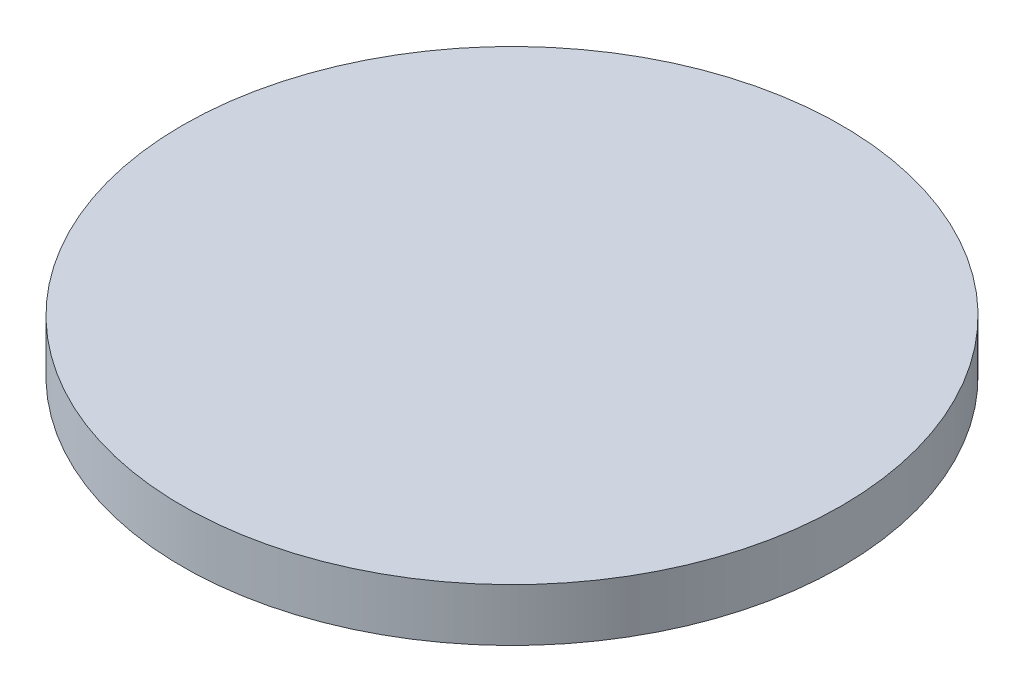
ISO-10303-21;
HEADER;
FILE_DESCRIPTION(('STEP AP214'),'2;1');
FILE_NAME('part.step','',(''),(''),'','','');
FILE_SCHEMA(('AUTOMOTIVE_DESIGN { 1 0 10303 214 1 1 1 1 }'));
ENDSEC;
DATA;
#1=APPLICATION_CONTEXT('core data for automotive mechanical design processes');
#2=APPLICATION_PROTOCOL_DEFINITION('international standard','automotive_design',2000,#1);
#3=PRODUCT_CONTEXT('',#1,'mechanical');
#4=PRODUCT('Part','Part','',(#3));
#5=PRODUCT_RELATED_PRODUCT_CATEGORY('part','',(#4));
#6=PRODUCT_DEFINITION_FORMATION('','',#4);
#7=PRODUCT_DEFINITION_CONTEXT('part definition',#1,'design');
#8=PRODUCT_DEFINITION('design','',#6,#7);
#9=PRODUCT_DEFINITION_SHAPE('','',#8);
#10=(LENGTH_UNIT() NAMED_UNIT(*) SI_UNIT(.MILLI.,.METRE.));
#11=(NAMED_UNIT(*) PLANE_ANGLE_UNIT() SI_UNIT($,.RADIAN.));
#12=(NAMED_UNIT(*) SI_UNIT($,.STERADIAN.) SOLID_ANGLE_UNIT());
#13=UNCERTAINTY_MEASURE_WITH_UNIT(LENGTH_MEASURE(1.E-05),#10,'distance_accuracy_value','');
#14=(GEOMETRIC_REPRESENTATION_CONTEXT(3) GLOBAL_UNCERTAINTY_ASSIGNED_CONTEXT((#13)) GLOBAL_UNIT_ASSIGNED_CONTEXT((#10,
#11,#12)) REPRESENTATION_CONTEXT('',''));
#15=CARTESIAN_POINT('',(0.,0.,0.));
#16=DIRECTION('',(0.,0.,1.));
#17=DIRECTION('',(1.,0.,0.));
#18=AXIS2_PLACEMENT_3D('',#15,#16,#17);
#19=CARTESIAN_POINT('',(-25.,0.,0.));
#20=DIRECTION('',(0.,1.,0.));
#21=DIRECTION('',(-1.,0.,0.));
#22=AXIS2_PLACEMENT_3D('',#19,#20,#21);
#23=PLANE('',#22);
#24=CARTESIAN_POINT('',(0.,0.,0.));
#25=DIRECTION('',(0.,-1.,0.));
#26=DIRECTION('',(1.,0.,0.));
#27=AXIS2_PLACEMENT_3D('',#24,#25,#26);
#28=CIRCLE('',#27,25.);
#29=CARTESIAN_POINT('',(25.,0.,0.));
#30=VERTEX_POINT('',#29);
#31=EDGE_CURVE('E44',#30,#30,#28,.T.);
#32=ORIENTED_EDGE('',*,*,#31,.T.);
#33=EDGE_LOOP('',(#32));
#34=FACE_BOUND('',#33,.T.);
#35=ADVANCED_FACE('F37',(#34),#23,.F.);
#36=CARTESIAN_POINT('',(-25.,4.,0.));
#37=DIRECTION('',(0.,-1.,0.));
#38=DIRECTION('',(1.,0.,0.));
#39=AXIS2_PLACEMENT_3D('',#36,#37,#38);
#40=PLANE('',#39);
#41=CARTESIAN_POINT('',(0.,4.00000000000001,0.));
#42=DIRECTION('',(0.,-1.,0.));
#43=DIRECTION('',(1.,0.,0.));
#44=AXIS2_PLACEMENT_3D('',#41,#42,#43);
#45=CIRCLE('',#44,25.);
#46=CARTESIAN_POINT('',(25.,4.00000000000001,0.));
#47=VERTEX_POINT('',#46);
#48=EDGE_CURVE('E10',#47,#47,#45,.T.);
#49=ORIENTED_EDGE('',*,*,#48,.F.);
#50=EDGE_LOOP('',(#49));
#51=FACE_BOUND('',#50,.T.);
#52=ADVANCED_FACE('F54',(#51),#40,.F.);
#53=CARTESIAN_POINT('',(0.,0.,0.));
#54=DIRECTION('',(0.,-1.,0.));
#55=DIRECTION('',(1.,0.,0.));
#56=AXIS2_PLACEMENT_3D('',#53,#54,#55);
#57=CYLINDRICAL_SURFACE('',#56,25.);
#58=ORIENTED_EDGE('',*,*,#31,.F.);
#59=EDGE_LOOP('',(#58));
#60=FACE_BOUND('',#59,.T.);
#61=ORIENTED_EDGE('',*,*,#48,.T.);
#62=EDGE_LOOP('',(#61));
#63=FACE_BOUND('',#62,.T.);
#64=ADVANCED_FACE('F52',(#60,#63),#57,.T.);
#65=CLOSED_SHELL('',(#35,#52,#64));
#66=MANIFOLD_SOLID_BREP('B2',#65);
#67=ADVANCED_BREP_SHAPE_REPRESENTATION('',(#18,#66),#14);
#68=SHAPE_DEFINITION_REPRESENTATION(#9,#67);
ENDSEC;
END-ISO-10303-21;
